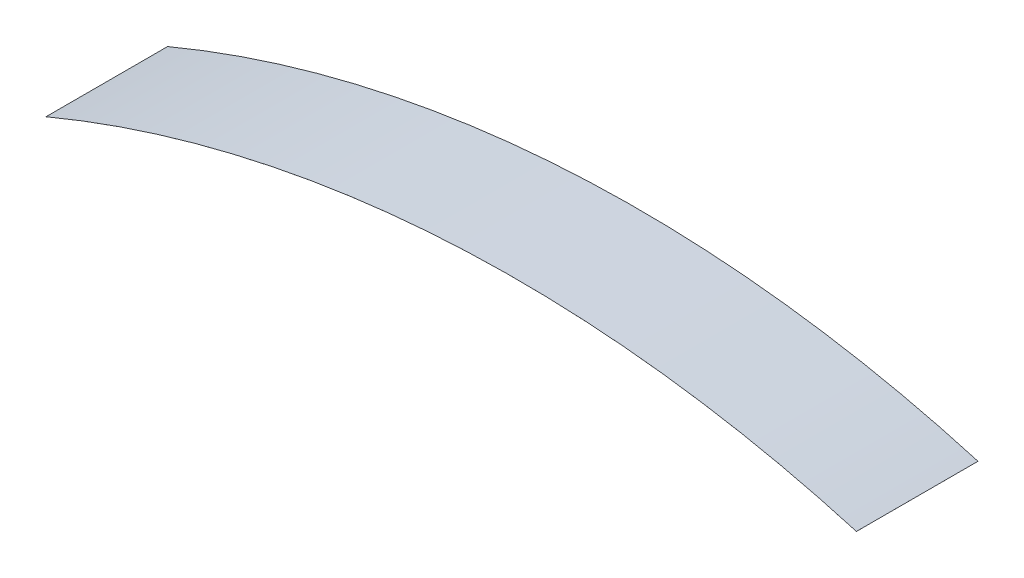
ISO-10303-21;
HEADER;
FILE_DESCRIPTION(('STEP AP214'),'2;1');
FILE_NAME('part.step','',(''),(''),'','','');
FILE_SCHEMA(('AUTOMOTIVE_DESIGN { 1 0 10303 214 1 1 1 1 }'));
ENDSEC;
DATA;
#1=APPLICATION_CONTEXT('core data for automotive mechanical design processes');
#2=APPLICATION_PROTOCOL_DEFINITION('international standard','automotive_design',2000,#1);
#3=PRODUCT_CONTEXT('',#1,'mechanical');
#4=PRODUCT('Part','Part','',(#3));
#5=PRODUCT_RELATED_PRODUCT_CATEGORY('part','',(#4));
#6=PRODUCT_DEFINITION_FORMATION('','',#4);
#7=PRODUCT_DEFINITION_CONTEXT('part definition',#1,'design');
#8=PRODUCT_DEFINITION('design','',#6,#7);
#9=PRODUCT_DEFINITION_SHAPE('','',#8);
#10=(LENGTH_UNIT() NAMED_UNIT(*) SI_UNIT(.MILLI.,.METRE.));
#11=(NAMED_UNIT(*) PLANE_ANGLE_UNIT() SI_UNIT($,.RADIAN.));
#12=(NAMED_UNIT(*) SI_UNIT($,.STERADIAN.) SOLID_ANGLE_UNIT());
#13=UNCERTAINTY_MEASURE_WITH_UNIT(LENGTH_MEASURE(1.E-05),#10,'distance_accuracy_value','');
#14=(GEOMETRIC_REPRESENTATION_CONTEXT(3) GLOBAL_UNCERTAINTY_ASSIGNED_CONTEXT((#13)) GLOBAL_UNIT_ASSIGNED_CONTEXT((#10,
#11,#12)) REPRESENTATION_CONTEXT('',''));
#15=CARTESIAN_POINT('',(0.,0.,0.));
#16=DIRECTION('',(0.,0.,1.));
#17=DIRECTION('',(1.,0.,0.));
#18=AXIS2_PLACEMENT_3D('',#15,#16,#17);
#19=CARTESIAN_POINT('',(0.,0.,15.));
#20=DIRECTION('',(0.,0.,-1.));
#21=DIRECTION('',(-1.,0.,0.));
#22=AXIS2_PLACEMENT_3D('',#19,#20,#21);
#23=CYLINDRICAL_SURFACE('',#22,150.001);
#24=CARTESIAN_POINT('',(0.,0.,0.));
#25=DIRECTION('',(0.,0.,1.));
#26=DIRECTION('',(1.,0.,0.));
#27=AXIS2_PLACEMENT_3D('',#24,#25,#26);
#28=CIRCLE('',#27,150.001);
#29=CARTESIAN_POINT('',(41.9770663274481,144.007728624338,0.));
#30=VERTEX_POINT('',#29);
#31=CARTESIAN_POINT('',(-58.0236003392185,138.324118665816,0.));
#32=VERTEX_POINT('',#31);
#33=EDGE_CURVE('E107',#30,#32,#28,.T.);
#34=ORIENTED_EDGE('',*,*,#33,.T.);
#35=DIRECTION('',(0.,0.,-1.));
#36=VECTOR('',#35,1.);
#37=CARTESIAN_POINT('',(-58.0236003392185,138.324118665816,15.));
#38=LINE('',#37,#36);
#39=CARTESIAN_POINT('',(-58.0236003392185,138.324118665816,15.));
#40=VERTEX_POINT('',#39);
#41=EDGE_CURVE('E11',#40,#32,#38,.T.);
#42=ORIENTED_EDGE('',*,*,#41,.F.);
#43=CARTESIAN_POINT('',(0.,0.,15.));
#44=DIRECTION('',(0.,0.,1.));
#45=DIRECTION('',(1.,0.,0.));
#46=AXIS2_PLACEMENT_3D('',#43,#44,#45);
#47=CIRCLE('',#46,150.001);
#48=CARTESIAN_POINT('',(41.9770663274481,144.007728624338,15.));
#49=VERTEX_POINT('',#48);
#50=EDGE_CURVE('E80',#49,#40,#47,.T.);
#51=ORIENTED_EDGE('',*,*,#50,.F.);
#52=DIRECTION('',(0.,0.,-1.));
#53=VECTOR('',#52,1.);
#54=CARTESIAN_POINT('',(41.9770663274481,144.007728624338,15.));
#55=LINE('',#54,#53);
#56=EDGE_CURVE('E56',#49,#30,#55,.T.);
#57=ORIENTED_EDGE('',*,*,#56,.T.);
#58=EDGE_LOOP('',(#34,#42,#51,#57));
#59=FACE_BOUND('',#58,.T.);
#60=ADVANCED_FACE('F39',(#59),#23,.T.);
#61=CARTESIAN_POINT('',(-58.023213517795,138.323196511172,15.));
#62=DIRECTION('',(-0.922154643409048,-0.386821423449028,0.));
#63=DIRECTION('',(0.386821423449028,-0.922154643409048,0.));
#64=AXIS2_PLACEMENT_3D('',#61,#62,#63);
#65=PLANE('',#64);
#66=DIRECTION('',(-0.386821423449028,0.922154643409048,0.));
#67=VECTOR('',#66,1.);
#68=CARTESIAN_POINT('',(-58.023213517795,138.323196511172,0.));
#69=LINE('',#68,#67);
#70=CARTESIAN_POINT('',(-58.023213517795,138.323196511172,0.));
#71=VERTEX_POINT('',#70);
#72=EDGE_CURVE('E89',#71,#32,#69,.T.);
#73=ORIENTED_EDGE('',*,*,#72,.F.);
#74=DIRECTION('',(0.,0.,-1.));
#75=VECTOR('',#74,1.);
#76=CARTESIAN_POINT('',(-58.023213517795,138.323196511172,15.));
#77=LINE('',#76,#75);
#78=CARTESIAN_POINT('',(-58.023213517795,138.323196511172,15.));
#79=VERTEX_POINT('',#78);
#80=EDGE_CURVE('E48',#79,#71,#77,.T.);
#81=ORIENTED_EDGE('',*,*,#80,.F.);
#82=DIRECTION('',(-0.386821423449028,0.922154643409048,0.));
#83=VECTOR('',#82,1.);
#84=CARTESIAN_POINT('',(-58.023213517795,138.323196511172,15.));
#85=LINE('',#84,#83);
#86=EDGE_CURVE('E87',#79,#40,#85,.T.);
#87=ORIENTED_EDGE('',*,*,#86,.T.);
#88=ORIENTED_EDGE('',*,*,#41,.T.);
#89=EDGE_LOOP('',(#73,#81,#87,#88));
#90=FACE_BOUND('',#89,.T.);
#91=ADVANCED_FACE('F86',(#90),#65,.T.);
#92=CARTESIAN_POINT('',(0.,0.,15.));
#93=DIRECTION('',(0.,0.,-1.));
#94=DIRECTION('',(-1.,0.,0.));
#95=AXIS2_PLACEMENT_3D('',#92,#93,#94);
#96=CYLINDRICAL_SURFACE('',#95,150.);
#97=CARTESIAN_POINT('',(0.,0.,0.));
#98=DIRECTION('',(0.,0.,1.));
#99=DIRECTION('',(1.,0.,0.));
#100=AXIS2_PLACEMENT_3D('',#97,#98,#99);
#101=CIRCLE('',#100,150.);
#102=CARTESIAN_POINT('',(41.9767864822049,144.006768579214,0.));
#103=VERTEX_POINT('',#102);
#104=EDGE_CURVE('E112',#103,#71,#101,.T.);
#105=ORIENTED_EDGE('',*,*,#104,.F.);
#106=DIRECTION('',(0.,0.,-1.));
#107=VECTOR('',#106,1.);
#108=CARTESIAN_POINT('',(41.9767864822049,144.006768579214,15.));
#109=LINE('',#108,#107);
#110=CARTESIAN_POINT('',(41.9767864822049,144.006768579214,15.));
#111=VERTEX_POINT('',#110);
#112=EDGE_CURVE('E69',#111,#103,#109,.T.);
#113=ORIENTED_EDGE('',*,*,#112,.F.);
#114=CARTESIAN_POINT('',(0.,0.,15.));
#115=DIRECTION('',(0.,0.,1.));
#116=DIRECTION('',(1.,0.,0.));
#117=AXIS2_PLACEMENT_3D('',#114,#115,#116);
#118=CIRCLE('',#117,150.);
#119=EDGE_CURVE('E96',#111,#79,#118,.T.);
#120=ORIENTED_EDGE('',*,*,#119,.T.);
#121=ORIENTED_EDGE('',*,*,#80,.T.);
#122=EDGE_LOOP('',(#105,#113,#120,#121));
#123=FACE_BOUND('',#122,.T.);
#124=ADVANCED_FACE('F99',(#123),#96,.F.);
#125=CARTESIAN_POINT('',(41.9770663274481,144.007728624338,15.));
#126=DIRECTION('',(0.960045123862228,-0.279845243211958,0.));
#127=DIRECTION('',(0.279845243211958,0.960045123862228,0.));
#128=AXIS2_PLACEMENT_3D('',#125,#126,#127);
#129=PLANE('',#128);
#130=DIRECTION('',(-0.279845243211958,-0.960045123862228,0.));
#131=VECTOR('',#130,1.);
#132=CARTESIAN_POINT('',(41.9770663274481,144.007728624338,0.));
#133=LINE('',#132,#131);
#134=EDGE_CURVE('E115',#30,#103,#133,.T.);
#135=ORIENTED_EDGE('',*,*,#134,.F.);
#136=ORIENTED_EDGE('',*,*,#56,.F.);
#137=DIRECTION('',(-0.279845243211958,-0.960045123862228,0.));
#138=VECTOR('',#137,1.);
#139=CARTESIAN_POINT('',(41.9770663274481,144.007728624338,15.));
#140=LINE('',#139,#138);
#141=EDGE_CURVE('E101',#49,#111,#140,.T.);
#142=ORIENTED_EDGE('',*,*,#141,.T.);
#143=ORIENTED_EDGE('',*,*,#112,.T.);
#144=EDGE_LOOP('',(#135,#136,#142,#143));
#145=FACE_BOUND('',#144,.T.);
#146=ADVANCED_FACE('F125',(#145),#129,.T.);
#147=CARTESIAN_POINT('',(0.,0.,15.));
#148=DIRECTION('',(0.,0.,1.));
#149=DIRECTION('',(1.,0.,0.));
#150=AXIS2_PLACEMENT_3D('',#147,#148,#149);
#151=PLANE('',#150);
#152=ORIENTED_EDGE('',*,*,#50,.T.);
#153=ORIENTED_EDGE('',*,*,#86,.F.);
#154=ORIENTED_EDGE('',*,*,#119,.F.);
#155=ORIENTED_EDGE('',*,*,#141,.F.);
#156=EDGE_LOOP('',(#152,#153,#154,#155));
#157=FACE_BOUND('',#156,.T.);
#158=ADVANCED_FACE('F95',(#157),#151,.T.);
#159=CARTESIAN_POINT('',(0.,0.,0.));
#160=DIRECTION('',(0.,0.,1.));
#161=DIRECTION('',(1.,0.,0.));
#162=AXIS2_PLACEMENT_3D('',#159,#160,#161);
#163=PLANE('',#162);
#164=ORIENTED_EDGE('',*,*,#33,.F.);
#165=ORIENTED_EDGE('',*,*,#134,.T.);
#166=ORIENTED_EDGE('',*,*,#104,.T.);
#167=ORIENTED_EDGE('',*,*,#72,.T.);
#168=EDGE_LOOP('',(#164,#165,#166,#167));
#169=FACE_BOUND('',#168,.T.);
#170=ADVANCED_FACE('F124',(#169),#163,.F.);
#171=CLOSED_SHELL('',(#60,#91,#124,#146,#158,#170));
#172=MANIFOLD_SOLID_BREP('B2',#171);
#173=ADVANCED_BREP_SHAPE_REPRESENTATION('',(#18,#172),#14);
#174=SHAPE_DEFINITION_REPRESENTATION(#9,#173);
ENDSEC;
END-ISO-10303-21;
